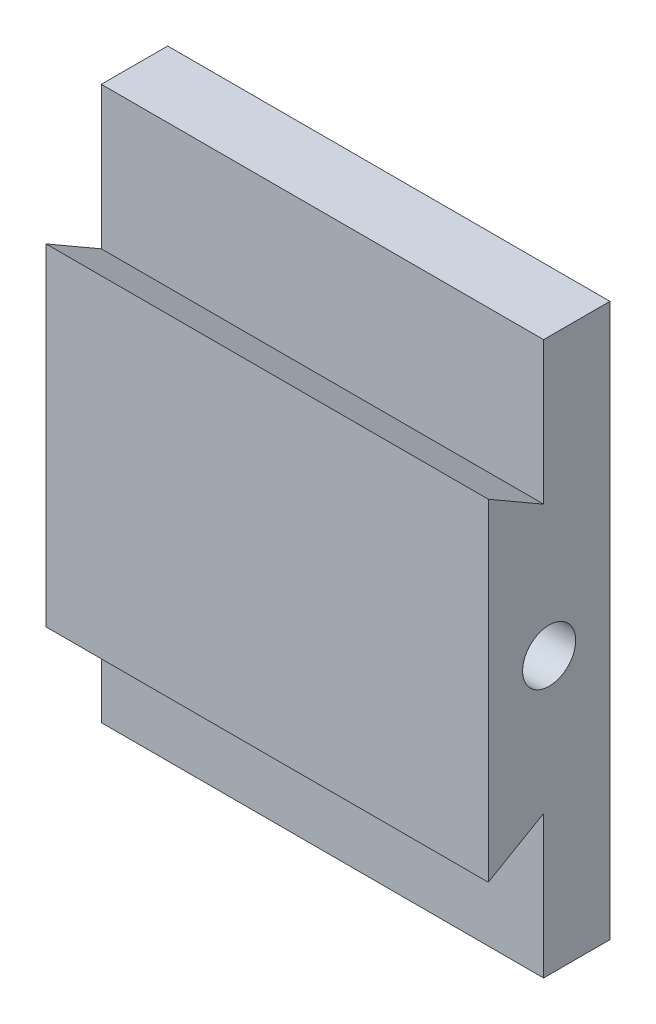
ISO-10303-21;
HEADER;
FILE_DESCRIPTION(('STEP AP214'),'2;1');
FILE_NAME('part.step','',(''),(''),'','','');
FILE_SCHEMA(('AUTOMOTIVE_DESIGN { 1 0 10303 214 1 1 1 1 }'));
ENDSEC;
DATA;
#1=APPLICATION_CONTEXT('core data for automotive mechanical design processes');
#2=APPLICATION_PROTOCOL_DEFINITION('international standard','automotive_design',2000,#1);
#3=PRODUCT_CONTEXT('',#1,'mechanical');
#4=PRODUCT('Part','Part','',(#3));
#5=PRODUCT_RELATED_PRODUCT_CATEGORY('part','',(#4));
#6=PRODUCT_DEFINITION_FORMATION('','',#4);
#7=PRODUCT_DEFINITION_CONTEXT('part definition',#1,'design');
#8=PRODUCT_DEFINITION('design','',#6,#7);
#9=PRODUCT_DEFINITION_SHAPE('','',#8);
#10=(LENGTH_UNIT() NAMED_UNIT(*) SI_UNIT(.MILLI.,.METRE.));
#11=(NAMED_UNIT(*) PLANE_ANGLE_UNIT() SI_UNIT($,.RADIAN.));
#12=(NAMED_UNIT(*) SI_UNIT($,.STERADIAN.) SOLID_ANGLE_UNIT());
#13=UNCERTAINTY_MEASURE_WITH_UNIT(LENGTH_MEASURE(1.E-05),#10,'distance_accuracy_value','');
#14=(GEOMETRIC_REPRESENTATION_CONTEXT(3) GLOBAL_UNCERTAINTY_ASSIGNED_CONTEXT((#13)) GLOBAL_UNIT_ASSIGNED_CONTEXT((#10,
#11,#12)) REPRESENTATION_CONTEXT('',''));
#15=CARTESIAN_POINT('',(0.,0.,0.));
#16=DIRECTION('',(0.,0.,1.));
#17=DIRECTION('',(1.,0.,0.));
#18=AXIS2_PLACEMENT_3D('',#15,#16,#17);
#19=CARTESIAN_POINT('',(4.,-1.21132486540518,-0.5));
#20=DIRECTION('',(0.,0.866025403784436,0.500000000000004));
#21=DIRECTION('',(0.,-0.500000000000004,0.866025403784436));
#22=AXIS2_PLACEMENT_3D('',#19,#20,#21);
#23=PLANE('',#22);
#24=DIRECTION('',(0.,0.500000000000004,-0.866025403784436));
#25=VECTOR('',#24,1.);
#26=CARTESIAN_POINT('',(0.,-1.21132486540518,-0.5));
#27=LINE('',#26,#25);
#28=CARTESIAN_POINT('',(0.,-1.5,0.));
#29=VERTEX_POINT('',#28);
#30=CARTESIAN_POINT('',(0.,-1.21132486540518,-0.5));
#31=VERTEX_POINT('',#30);
#32=EDGE_CURVE('E129',#29,#31,#27,.T.);
#33=ORIENTED_EDGE('',*,*,#32,.T.);
#34=DIRECTION('',(-1.,0.,0.));
#35=VECTOR('',#34,1.);
#36=CARTESIAN_POINT('',(4.,-1.21132486540518,-0.5));
#37=LINE('',#36,#35);
#38=CARTESIAN_POINT('',(4.,-1.21132486540518,-0.5));
#39=VERTEX_POINT('',#38);
#40=EDGE_CURVE('E11',#39,#31,#37,.T.);
#41=ORIENTED_EDGE('',*,*,#40,.F.);
#42=DIRECTION('',(0.,0.500000000000004,-0.866025403784436));
#43=VECTOR('',#42,1.);
#44=CARTESIAN_POINT('',(4.,-1.21132486540518,-0.5));
#45=LINE('',#44,#43);
#46=CARTESIAN_POINT('',(4.,-1.5,0.));
#47=VERTEX_POINT('',#46);
#48=EDGE_CURVE('E144',#47,#39,#45,.T.);
#49=ORIENTED_EDGE('',*,*,#48,.F.);
#50=DIRECTION('',(-1.,0.,0.));
#51=VECTOR('',#50,1.);
#52=CARTESIAN_POINT('',(4.,-1.5,0.));
#53=LINE('',#52,#51);
#54=EDGE_CURVE('E125',#47,#29,#53,.T.);
#55=ORIENTED_EDGE('',*,*,#54,.T.);
#56=EDGE_LOOP('',(#33,#41,#49,#55));
#57=FACE_BOUND('',#56,.T.);
#58=ADVANCED_FACE('F33',(#57),#23,.F.);
#59=CARTESIAN_POINT('',(4.,-2.5,-0.5));
#60=DIRECTION('',(0.,0.,-1.));
#61=DIRECTION('',(-1.,0.,0.));
#62=AXIS2_PLACEMENT_3D('',#59,#60,#61);
#63=PLANE('',#62);
#64=DIRECTION('',(0.,-1.,0.));
#65=VECTOR('',#64,1.);
#66=CARTESIAN_POINT('',(0.,-2.5,-0.5));
#67=LINE('',#66,#65);
#68=CARTESIAN_POINT('',(0.,-2.5,-0.5));
#69=VERTEX_POINT('',#68);
#70=EDGE_CURVE('E132',#31,#69,#67,.T.);
#71=ORIENTED_EDGE('',*,*,#70,.T.);
#72=DIRECTION('',(-1.,0.,0.));
#73=VECTOR('',#72,1.);
#74=CARTESIAN_POINT('',(4.,-2.5,-0.5));
#75=LINE('',#74,#73);
#76=CARTESIAN_POINT('',(4.,-2.5,-0.5));
#77=VERTEX_POINT('',#76);
#78=EDGE_CURVE('E41',#77,#69,#75,.T.);
#79=ORIENTED_EDGE('',*,*,#78,.F.);
#80=DIRECTION('',(0.,-1.,0.));
#81=VECTOR('',#80,1.);
#82=CARTESIAN_POINT('',(4.,-2.5,-0.5));
#83=LINE('',#82,#81);
#84=EDGE_CURVE('E92',#39,#77,#83,.T.);
#85=ORIENTED_EDGE('',*,*,#84,.F.);
#86=ORIENTED_EDGE('',*,*,#40,.T.);
#87=EDGE_LOOP('',(#71,#79,#85,#86));
#88=FACE_BOUND('',#87,.T.);
#89=ADVANCED_FACE('F200',(#88),#63,.F.);
#90=CARTESIAN_POINT('',(4.,-2.5,-1.1));
#91=DIRECTION('',(0.,1.,0.));
#92=DIRECTION('',(0.,0.,1.));
#93=AXIS2_PLACEMENT_3D('',#90,#91,#92);
#94=PLANE('',#93);
#95=DIRECTION('',(0.,0.,-1.));
#96=VECTOR('',#95,1.);
#97=CARTESIAN_POINT('',(0.,-2.5,-1.1));
#98=LINE('',#97,#96);
#99=CARTESIAN_POINT('',(0.,-2.5,-1.1));
#100=VERTEX_POINT('',#99);
#101=EDGE_CURVE('E135',#69,#100,#98,.T.);
#102=ORIENTED_EDGE('',*,*,#101,.T.);
#103=DIRECTION('',(-1.,0.,0.));
#104=VECTOR('',#103,1.);
#105=CARTESIAN_POINT('',(4.,-2.5,-1.1));
#106=LINE('',#105,#104);
#107=CARTESIAN_POINT('',(4.,-2.5,-1.1));
#108=VERTEX_POINT('',#107);
#109=EDGE_CURVE('E151',#108,#100,#106,.T.);
#110=ORIENTED_EDGE('',*,*,#109,.F.);
#111=DIRECTION('',(0.,0.,-1.));
#112=VECTOR('',#111,1.);
#113=CARTESIAN_POINT('',(4.,-2.5,-1.1));
#114=LINE('',#113,#112);
#115=EDGE_CURVE('E159',#77,#108,#114,.T.);
#116=ORIENTED_EDGE('',*,*,#115,.F.);
#117=ORIENTED_EDGE('',*,*,#78,.T.);
#118=EDGE_LOOP('',(#102,#110,#116,#117));
#119=FACE_BOUND('',#118,.T.);
#120=ADVANCED_FACE('F157',(#119),#94,.F.);
#121=CARTESIAN_POINT('',(4.,2.5,-1.1));
#122=DIRECTION('',(0.,0.,1.));
#123=DIRECTION('',(0.,-1.,0.));
#124=AXIS2_PLACEMENT_3D('',#121,#122,#123);
#125=PLANE('',#124);
#126=DIRECTION('',(0.,1.,0.));
#127=VECTOR('',#126,1.);
#128=CARTESIAN_POINT('',(0.,2.5,-1.1));
#129=LINE('',#128,#127);
#130=CARTESIAN_POINT('',(0.,2.5,-1.1));
#131=VERTEX_POINT('',#130);
#132=EDGE_CURVE('E137',#100,#131,#129,.T.);
#133=ORIENTED_EDGE('',*,*,#132,.T.);
#134=DIRECTION('',(-1.,0.,0.));
#135=VECTOR('',#134,1.);
#136=CARTESIAN_POINT('',(4.,2.5,-1.1));
#137=LINE('',#136,#135);
#138=CARTESIAN_POINT('',(4.,2.5,-1.1));
#139=VERTEX_POINT('',#138);
#140=EDGE_CURVE('E148',#139,#131,#137,.T.);
#141=ORIENTED_EDGE('',*,*,#140,.F.);
#142=DIRECTION('',(0.,1.,0.));
#143=VECTOR('',#142,1.);
#144=CARTESIAN_POINT('',(4.,2.5,-1.1));
#145=LINE('',#144,#143);
#146=EDGE_CURVE('E171',#108,#139,#145,.T.);
#147=ORIENTED_EDGE('',*,*,#146,.F.);
#148=ORIENTED_EDGE('',*,*,#109,.T.);
#149=EDGE_LOOP('',(#133,#141,#147,#148));
#150=FACE_BOUND('',#149,.T.);
#151=ADVANCED_FACE('F167',(#150),#125,.F.);
#152=CARTESIAN_POINT('',(4.,2.5,-0.5));
#153=DIRECTION('',(0.,-1.,0.));
#154=DIRECTION('',(0.,0.,-1.));
#155=AXIS2_PLACEMENT_3D('',#152,#153,#154);
#156=PLANE('',#155);
#157=DIRECTION('',(0.,0.,1.));
#158=VECTOR('',#157,1.);
#159=CARTESIAN_POINT('',(0.,2.5,-0.5));
#160=LINE('',#159,#158);
#161=CARTESIAN_POINT('',(0.,2.5,-0.5));
#162=VERTEX_POINT('',#161);
#163=EDGE_CURVE('E139',#131,#162,#160,.T.);
#164=ORIENTED_EDGE('',*,*,#163,.T.);
#165=DIRECTION('',(-1.,0.,0.));
#166=VECTOR('',#165,1.);
#167=CARTESIAN_POINT('',(4.,2.5,-0.5));
#168=LINE('',#167,#166);
#169=CARTESIAN_POINT('',(4.,2.5,-0.5));
#170=VERTEX_POINT('',#169);
#171=EDGE_CURVE('E120',#170,#162,#168,.T.);
#172=ORIENTED_EDGE('',*,*,#171,.F.);
#173=DIRECTION('',(0.,0.,1.));
#174=VECTOR('',#173,1.);
#175=CARTESIAN_POINT('',(4.,2.5,-0.5));
#176=LINE('',#175,#174);
#177=EDGE_CURVE('E111',#139,#170,#176,.T.);
#178=ORIENTED_EDGE('',*,*,#177,.F.);
#179=ORIENTED_EDGE('',*,*,#140,.T.);
#180=EDGE_LOOP('',(#164,#172,#178,#179));
#181=FACE_BOUND('',#180,.T.);
#182=ADVANCED_FACE('F170',(#181),#156,.F.);
#183=CARTESIAN_POINT('',(4.,1.21132486540518,-0.5));
#184=DIRECTION('',(0.,0.,-1.));
#185=DIRECTION('',(-1.,0.,0.));
#186=AXIS2_PLACEMENT_3D('',#183,#184,#185);
#187=PLANE('',#186);
#188=DIRECTION('',(0.,-1.,0.));
#189=VECTOR('',#188,1.);
#190=CARTESIAN_POINT('',(0.,1.21132486540518,-0.5));
#191=LINE('',#190,#189);
#192=CARTESIAN_POINT('',(0.,1.21132486540518,-0.5));
#193=VERTEX_POINT('',#192);
#194=EDGE_CURVE('E119',#162,#193,#191,.T.);
#195=ORIENTED_EDGE('',*,*,#194,.T.);
#196=DIRECTION('',(-1.,0.,0.));
#197=VECTOR('',#196,1.);
#198=CARTESIAN_POINT('',(4.,1.21132486540518,-0.5));
#199=LINE('',#198,#197);
#200=CARTESIAN_POINT('',(4.,1.21132486540518,-0.5));
#201=VERTEX_POINT('',#200);
#202=EDGE_CURVE('E116',#201,#193,#199,.T.);
#203=ORIENTED_EDGE('',*,*,#202,.F.);
#204=DIRECTION('',(0.,-1.,0.));
#205=VECTOR('',#204,1.);
#206=CARTESIAN_POINT('',(4.,1.21132486540518,-0.5));
#207=LINE('',#206,#205);
#208=EDGE_CURVE('E105',#170,#201,#207,.T.);
#209=ORIENTED_EDGE('',*,*,#208,.F.);
#210=ORIENTED_EDGE('',*,*,#171,.T.);
#211=EDGE_LOOP('',(#195,#203,#209,#210));
#212=FACE_BOUND('',#211,.T.);
#213=ADVANCED_FACE('F117',(#212),#187,.F.);
#214=CARTESIAN_POINT('',(4.,1.5,0.));
#215=DIRECTION('',(0.,-0.866025403784436,0.500000000000004));
#216=DIRECTION('',(0.,-0.500000000000004,-0.866025403784436));
#217=AXIS2_PLACEMENT_3D('',#214,#215,#216);
#218=PLANE('',#217);
#219=DIRECTION('',(0.,0.500000000000004,0.866025403784436));
#220=VECTOR('',#219,1.);
#221=CARTESIAN_POINT('',(0.,1.5,0.));
#222=LINE('',#221,#220);
#223=CARTESIAN_POINT('',(0.,1.5,0.));
#224=VERTEX_POINT('',#223);
#225=EDGE_CURVE('E78',#193,#224,#222,.T.);
#226=ORIENTED_EDGE('',*,*,#225,.T.);
#227=DIRECTION('',(-1.,0.,0.));
#228=VECTOR('',#227,1.);
#229=CARTESIAN_POINT('',(4.,1.5,0.));
#230=LINE('',#229,#228);
#231=CARTESIAN_POINT('',(4.,1.5,0.));
#232=VERTEX_POINT('',#231);
#233=EDGE_CURVE('E121',#232,#224,#230,.T.);
#234=ORIENTED_EDGE('',*,*,#233,.F.);
#235=DIRECTION('',(0.,0.500000000000004,0.866025403784436));
#236=VECTOR('',#235,1.);
#237=CARTESIAN_POINT('',(4.,1.5,0.));
#238=LINE('',#237,#236);
#239=EDGE_CURVE('E109',#201,#232,#238,.T.);
#240=ORIENTED_EDGE('',*,*,#239,.F.);
#241=ORIENTED_EDGE('',*,*,#202,.T.);
#242=EDGE_LOOP('',(#226,#234,#240,#241));
#243=FACE_BOUND('',#242,.T.);
#244=ADVANCED_FACE('F123',(#243),#218,.F.);
#245=CARTESIAN_POINT('',(4.,-1.5,0.));
#246=DIRECTION('',(0.,0.,-1.));
#247=DIRECTION('',(-1.,0.,0.));
#248=AXIS2_PLACEMENT_3D('',#245,#246,#247);
#249=PLANE('',#248);
#250=DIRECTION('',(0.,-1.,0.));
#251=VECTOR('',#250,1.);
#252=CARTESIAN_POINT('',(0.,-1.5,0.));
#253=LINE('',#252,#251);
#254=EDGE_CURVE('E84',#224,#29,#253,.T.);
#255=ORIENTED_EDGE('',*,*,#254,.T.);
#256=ORIENTED_EDGE('',*,*,#54,.F.);
#257=DIRECTION('',(0.,-1.,0.));
#258=VECTOR('',#257,1.);
#259=CARTESIAN_POINT('',(4.,-1.5,0.));
#260=LINE('',#259,#258);
#261=EDGE_CURVE('E49',#232,#47,#260,.T.);
#262=ORIENTED_EDGE('',*,*,#261,.F.);
#263=ORIENTED_EDGE('',*,*,#233,.T.);
#264=EDGE_LOOP('',(#255,#256,#262,#263));
#265=FACE_BOUND('',#264,.T.);
#266=ADVANCED_FACE('F191',(#265),#249,.F.);
#267=CARTESIAN_POINT('',(4.,0.,0.));
#268=DIRECTION('',(-1.,0.,0.));
#269=DIRECTION('',(0.,0.,1.));
#270=AXIS2_PLACEMENT_3D('',#267,#268,#269);
#271=PLANE('',#270);
#272=CARTESIAN_POINT('',(4.,0.,-0.55));
#273=DIRECTION('',(1.,0.,0.));
#274=DIRECTION('',(0.,0.,-1.));
#275=AXIS2_PLACEMENT_3D('',#272,#273,#274);
#276=CIRCLE('',#275,0.24);
#277=CARTESIAN_POINT('',(4.,0.,-0.79));
#278=VERTEX_POINT('',#277);
#279=EDGE_CURVE('E177',#278,#278,#276,.T.);
#280=ORIENTED_EDGE('',*,*,#279,.F.);
#281=EDGE_LOOP('',(#280));
#282=FACE_BOUND('',#281,.T.);
#283=ORIENTED_EDGE('',*,*,#48,.T.);
#284=ORIENTED_EDGE('',*,*,#84,.T.);
#285=ORIENTED_EDGE('',*,*,#115,.T.);
#286=ORIENTED_EDGE('',*,*,#146,.T.);
#287=ORIENTED_EDGE('',*,*,#177,.T.);
#288=ORIENTED_EDGE('',*,*,#208,.T.);
#289=ORIENTED_EDGE('',*,*,#239,.T.);
#290=ORIENTED_EDGE('',*,*,#261,.T.);
#291=EDGE_LOOP('',(#283,#284,#285,#286,#287,#288,#289,#290));
#292=FACE_BOUND('',#291,.T.);
#293=ADVANCED_FACE('F107',(#282,#292),#271,.F.);
#294=CARTESIAN_POINT('',(0.,0.,0.));
#295=DIRECTION('',(-1.,0.,0.));
#296=DIRECTION('',(0.,0.,1.));
#297=AXIS2_PLACEMENT_3D('',#294,#295,#296);
#298=PLANE('',#297);
#299=CARTESIAN_POINT('',(0.,0.,-0.55));
#300=DIRECTION('',(1.,0.,0.));
#301=DIRECTION('',(0.,0.,-1.));
#302=AXIS2_PLACEMENT_3D('',#299,#300,#301);
#303=CIRCLE('',#302,0.24);
#304=CARTESIAN_POINT('',(0.,0.,-0.79));
#305=VERTEX_POINT('',#304);
#306=EDGE_CURVE('E133',#305,#305,#303,.T.);
#307=ORIENTED_EDGE('',*,*,#306,.T.);
#308=EDGE_LOOP('',(#307));
#309=FACE_BOUND('',#308,.T.);
#310=ORIENTED_EDGE('',*,*,#32,.F.);
#311=ORIENTED_EDGE('',*,*,#254,.F.);
#312=ORIENTED_EDGE('',*,*,#225,.F.);
#313=ORIENTED_EDGE('',*,*,#194,.F.);
#314=ORIENTED_EDGE('',*,*,#163,.F.);
#315=ORIENTED_EDGE('',*,*,#132,.F.);
#316=ORIENTED_EDGE('',*,*,#101,.F.);
#317=ORIENTED_EDGE('',*,*,#70,.F.);
#318=EDGE_LOOP('',(#310,#311,#312,#313,#314,#315,#316,#317));
#319=FACE_BOUND('',#318,.T.);
#320=ADVANCED_FACE('F163',(#309,#319),#298,.T.);
#321=CARTESIAN_POINT('',(0.,0.,-0.55));
#322=DIRECTION('',(1.,0.,0.));
#323=DIRECTION('',(0.,0.,-1.));
#324=AXIS2_PLACEMENT_3D('',#321,#322,#323);
#325=CYLINDRICAL_SURFACE('',#324,0.24);
#326=ORIENTED_EDGE('',*,*,#306,.F.);
#327=EDGE_LOOP('',(#326));
#328=FACE_BOUND('',#327,.T.);
#329=ORIENTED_EDGE('',*,*,#279,.T.);
#330=EDGE_LOOP('',(#329));
#331=FACE_BOUND('',#330,.T.);
#332=ADVANCED_FACE('F184',(#328,#331),#325,.F.);
#333=CLOSED_SHELL('',(#58,#89,#120,#151,#182,#213,#244,#266,#293,#320,#332));
#334=MANIFOLD_SOLID_BREP('B2',#333);
#335=ADVANCED_BREP_SHAPE_REPRESENTATION('',(#18,#334),#14);
#336=SHAPE_DEFINITION_REPRESENTATION(#9,#335);
ENDSEC;
END-ISO-10303-21;
